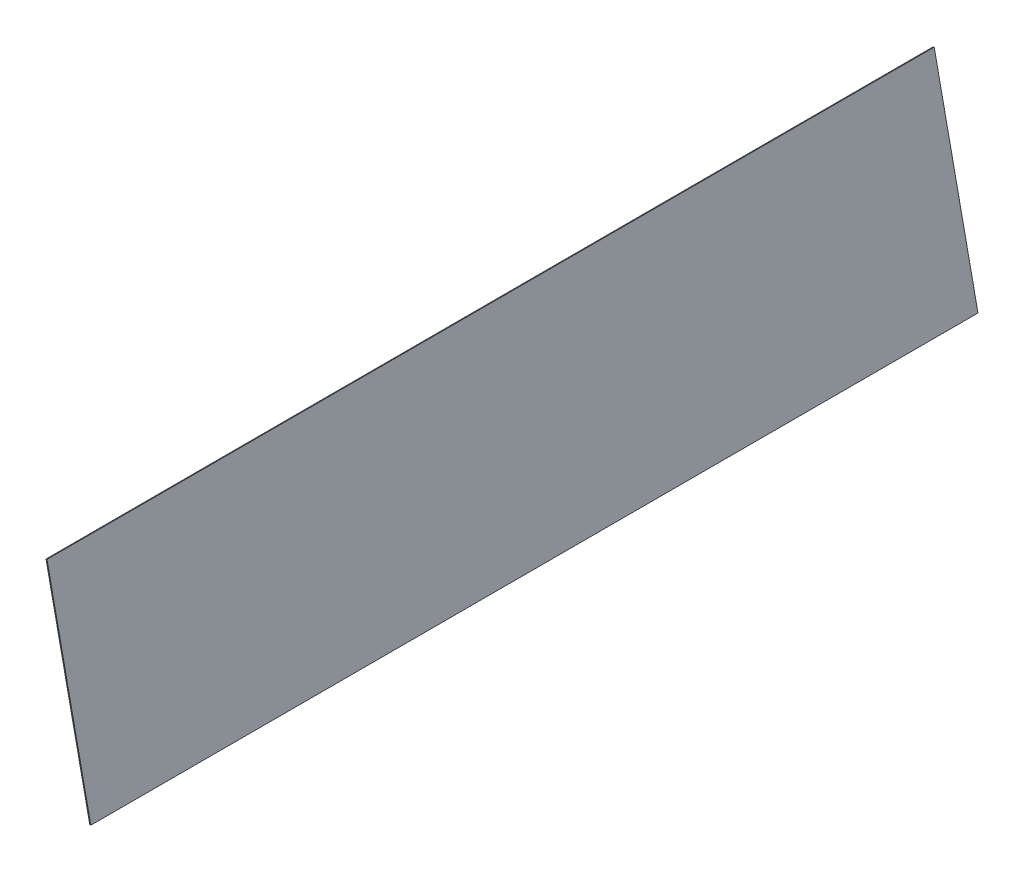
ISO-10303-21;
HEADER;
FILE_DESCRIPTION(('STEP AP214'),'2;1');
FILE_NAME('part.step','',(''),(''),'','','');
FILE_SCHEMA(('AUTOMOTIVE_DESIGN { 1 0 10303 214 1 1 1 1 }'));
ENDSEC;
DATA;
#1=APPLICATION_CONTEXT('core data for automotive mechanical design processes');
#2=APPLICATION_PROTOCOL_DEFINITION('international standard','automotive_design',2000,#1);
#3=PRODUCT_CONTEXT('',#1,'mechanical');
#4=PRODUCT('Part','Part','',(#3));
#5=PRODUCT_RELATED_PRODUCT_CATEGORY('part','',(#4));
#6=PRODUCT_DEFINITION_FORMATION('','',#4);
#7=PRODUCT_DEFINITION_CONTEXT('part definition',#1,'design');
#8=PRODUCT_DEFINITION('design','',#6,#7);
#9=PRODUCT_DEFINITION_SHAPE('','',#8);
#10=(LENGTH_UNIT() NAMED_UNIT(*) SI_UNIT(.MILLI.,.METRE.));
#11=(NAMED_UNIT(*) PLANE_ANGLE_UNIT() SI_UNIT($,.RADIAN.));
#12=(NAMED_UNIT(*) SI_UNIT($,.STERADIAN.) SOLID_ANGLE_UNIT());
#13=UNCERTAINTY_MEASURE_WITH_UNIT(LENGTH_MEASURE(1.E-05),#10,'distance_accuracy_value','');
#14=(GEOMETRIC_REPRESENTATION_CONTEXT(3) GLOBAL_UNCERTAINTY_ASSIGNED_CONTEXT((#13)) GLOBAL_UNIT_ASSIGNED_CONTEXT((#10,
#11,#12)) REPRESENTATION_CONTEXT('',''));
#15=CARTESIAN_POINT('',(0.,0.,0.));
#16=DIRECTION('',(0.,0.,1.));
#17=DIRECTION('',(1.,0.,0.));
#18=AXIS2_PLACEMENT_3D('',#15,#16,#17);
#19=CARTESIAN_POINT('',(43.62839930494,6.992136697285,4.95));
#20=DIRECTION('',(0.978598276565702,0.205780011426372,0.));
#21=DIRECTION('',(0.,0.,1.));
#22=AXIS2_PLACEMENT_3D('',#19,#20,#21);
#23=PLANE('',#22);
#24=DIRECTION('',(0.,0.,-1.));
#25=VECTOR('',#24,1.);
#26=CARTESIAN_POINT('',(43.6530938940894,6.87470020663744,14.05));
#27=LINE('',#26,#25);
#28=CARTESIAN_POINT('',(43.6530938940932,6.87470020663761,22.8));
#29=VERTEX_POINT('',#28);
#30=CARTESIAN_POINT('',(43.6530938940919,6.87470020663759,5.3));
#31=VERTEX_POINT('',#30);
#32=EDGE_CURVE('E21',#29,#31,#27,.T.);
#33=ORIENTED_EDGE('',*,*,#32,.F.);
#34=DIRECTION('',(-0.20578001142641,0.978598276565694,0.));
#35=VECTOR('',#34,1.);
#36=CARTESIAN_POINT('',(44.0852319180893,4.81964382585042,22.8));
#37=LINE('',#36,#35);
#38=CARTESIAN_POINT('',(44.5173699420861,2.76458744506257,22.8));
#39=VERTEX_POINT('',#38);
#40=EDGE_CURVE('E59',#39,#29,#37,.T.);
#41=ORIENTED_EDGE('',*,*,#40,.F.);
#42=DIRECTION('',(0.,0.,1.));
#43=VECTOR('',#42,1.);
#44=CARTESIAN_POINT('',(44.5173699420892,2.76458744506244,14.05));
#45=LINE('',#44,#43);
#46=CARTESIAN_POINT('',(44.5173699420861,2.76458744506257,5.3));
#47=VERTEX_POINT('',#46);
#48=EDGE_CURVE('E54',#47,#39,#45,.T.);
#49=ORIENTED_EDGE('',*,*,#48,.F.);
#50=DIRECTION('',(0.20578001142641,-0.978598276565694,0.));
#51=VECTOR('',#50,1.);
#52=CARTESIAN_POINT('',(44.0852319180893,4.81964382585042,5.3));
#53=LINE('',#52,#51);
#54=EDGE_CURVE('E69',#31,#47,#53,.T.);
#55=ORIENTED_EDGE('',*,*,#54,.F.);
#56=EDGE_LOOP('',(#33,#41,#49,#55));
#57=FACE_BOUND('',#56,.T.);
#58=ADVANCED_FACE('F17',(#57),#23,.T.);
#59=CARTESIAN_POINT('',(43.63313048925,6.870502294405,4.95));
#60=DIRECTION('',(-0.205780011420343,0.97859827656697,0.));
#61=DIRECTION('',(0.,0.,1.));
#62=AXIS2_PLACEMENT_3D('',#59,#60,#61);
#63=PLANE('',#62);
#64=DIRECTION('',(0.,0.,1.));
#65=VECTOR('',#64,1.);
#66=CARTESIAN_POINT('',(43.633521928555,6.87058460640952,14.05));
#67=LINE('',#66,#65);
#68=CARTESIAN_POINT('',(43.633521928558,6.87058460640944,5.3));
#69=VERTEX_POINT('',#68);
#70=CARTESIAN_POINT('',(43.633521928558,6.87058460640944,22.8));
#71=VERTEX_POINT('',#70);
#72=EDGE_CURVE('E75',#69,#71,#67,.T.);
#73=ORIENTED_EDGE('',*,*,#72,.T.);
#74=DIRECTION('',(-0.978598276577051,-0.205780011372404,0.));
#75=VECTOR('',#74,1.);
#76=CARTESIAN_POINT('',(43.6433079113249,6.87264240652352,22.8));
#77=LINE('',#76,#75);
#78=EDGE_CURVE('E64',#29,#71,#77,.T.);
#79=ORIENTED_EDGE('',*,*,#78,.F.);
#80=ORIENTED_EDGE('',*,*,#32,.T.);
#81=DIRECTION('',(0.978598276577051,0.205780011372404,0.));
#82=VECTOR('',#81,1.);
#83=CARTESIAN_POINT('',(43.6433079113249,6.87264240652352,5.3));
#84=LINE('',#83,#82);
#85=EDGE_CURVE('E80',#69,#31,#84,.T.);
#86=ORIENTED_EDGE('',*,*,#85,.F.);
#87=EDGE_LOOP('',(#73,#79,#80,#86));
#88=FACE_BOUND('',#87,.T.);
#89=ADVANCED_FACE('F74',(#88),#63,.T.);
#90=CARTESIAN_POINT('',(43.60843590009,6.987938785052,22.8));
#91=DIRECTION('',(0.,0.,1.));
#92=DIRECTION('',(0.205780011428524,-0.978598276565249,0.));
#93=AXIS2_PLACEMENT_3D('',#90,#91,#92);
#94=PLANE('',#93);
#95=ORIENTED_EDGE('',*,*,#40,.T.);
#96=ORIENTED_EDGE('',*,*,#78,.T.);
#97=DIRECTION('',(0.205780011428526,-0.978598276565249,0.));
#98=VECTOR('',#97,1.);
#99=CARTESIAN_POINT('',(44.065659952555,4.815528225622,22.8));
#100=LINE('',#99,#98);
#101=CARTESIAN_POINT('',(44.4977979765542,2.76047184483429,22.8));
#102=VERTEX_POINT('',#101);
#103=EDGE_CURVE('E85',#71,#102,#100,.T.);
#104=ORIENTED_EDGE('',*,*,#103,.T.);
#105=DIRECTION('',(-0.978598276587289,-0.205780011323712,0.));
#106=VECTOR('',#105,1.);
#107=CARTESIAN_POINT('',(44.50758395932,2.7625296449485,22.8));
#108=LINE('',#107,#106);
#109=EDGE_CURVE('E66',#39,#102,#108,.T.);
#110=ORIENTED_EDGE('',*,*,#109,.F.);
#111=EDGE_LOOP('',(#95,#96,#104,#110));
#112=FACE_BOUND('',#111,.T.);
#113=ADVANCED_FACE('F61',(#112),#94,.T.);
#114=CARTESIAN_POINT('',(44.49740653724,2.76038953283,23.15));
#115=DIRECTION('',(0.205780011323712,-0.978598276587289,0.));
#116=DIRECTION('',(0.,0.,-1.));
#117=AXIS2_PLACEMENT_3D('',#114,#115,#116);
#118=PLANE('',#117);
#119=ORIENTED_EDGE('',*,*,#48,.T.);
#120=ORIENTED_EDGE('',*,*,#109,.T.);
#121=DIRECTION('',(0.,0.,-1.));
#122=VECTOR('',#121,1.);
#123=CARTESIAN_POINT('',(44.497797976555,2.76047184483448,14.05));
#124=LINE('',#123,#122);
#125=CARTESIAN_POINT('',(44.497797976553,2.76047184483441,5.3));
#126=VERTEX_POINT('',#125);
#127=EDGE_CURVE('E27',#102,#126,#124,.T.);
#128=ORIENTED_EDGE('',*,*,#127,.T.);
#129=DIRECTION('',(-0.978598276557802,-0.205780011463941,0.));
#130=VECTOR('',#129,1.);
#131=CARTESIAN_POINT('',(44.5075839593201,2.76252964494848,5.3));
#132=LINE('',#131,#130);
#133=EDGE_CURVE('E35',#47,#126,#132,.T.);
#134=ORIENTED_EDGE('',*,*,#133,.F.);
#135=EDGE_LOOP('',(#119,#120,#128,#134));
#136=FACE_BOUND('',#135,.T.);
#137=ADVANCED_FACE('F89',(#136),#118,.T.);
#138=CARTESIAN_POINT('',(44.5221011264,2.642953042182,5.3));
#139=DIRECTION('',(0.,0.,-1.));
#140=DIRECTION('',(-0.205780011428524,0.978598276565249,0.));
#141=AXIS2_PLACEMENT_3D('',#138,#139,#140);
#142=PLANE('',#141);
#143=ORIENTED_EDGE('',*,*,#54,.T.);
#144=ORIENTED_EDGE('',*,*,#133,.T.);
#145=DIRECTION('',(-0.205780011428524,0.978598276565249,0.));
#146=VECTOR('',#145,1.);
#147=CARTESIAN_POINT('',(44.065659952555,4.815528225622,5.3));
#148=LINE('',#147,#146);
#149=EDGE_CURVE('E11',#126,#69,#148,.T.);
#150=ORIENTED_EDGE('',*,*,#149,.T.);
#151=ORIENTED_EDGE('',*,*,#85,.T.);
#152=EDGE_LOOP('',(#143,#144,#150,#151));
#153=FACE_BOUND('',#152,.T.);
#154=ADVANCED_FACE('F91',(#153),#142,.T.);
#155=CARTESIAN_POINT('',(43.6088273394,6.988021097057,4.95));
#156=DIRECTION('',(0.978598276565249,0.205780011428526,0.));
#157=DIRECTION('',(0.,0.,1.));
#158=AXIS2_PLACEMENT_3D('',#155,#156,#157);
#159=PLANE('',#158);
#160=ORIENTED_EDGE('',*,*,#127,.F.);
#161=ORIENTED_EDGE('',*,*,#103,.F.);
#162=ORIENTED_EDGE('',*,*,#72,.F.);
#163=ORIENTED_EDGE('',*,*,#149,.F.);
#164=EDGE_LOOP('',(#160,#161,#162,#163));
#165=FACE_BOUND('',#164,.T.);
#166=ADVANCED_FACE('F19',(#165),#159,.F.);
#167=CLOSED_SHELL('',(#58,#89,#113,#137,#154,#166));
#168=MANIFOLD_SOLID_BREP('B1',#167);
#169=ADVANCED_BREP_SHAPE_REPRESENTATION('',(#18,#168),#14);
#170=SHAPE_DEFINITION_REPRESENTATION(#9,#169);
ENDSEC;
END-ISO-10303-21;
